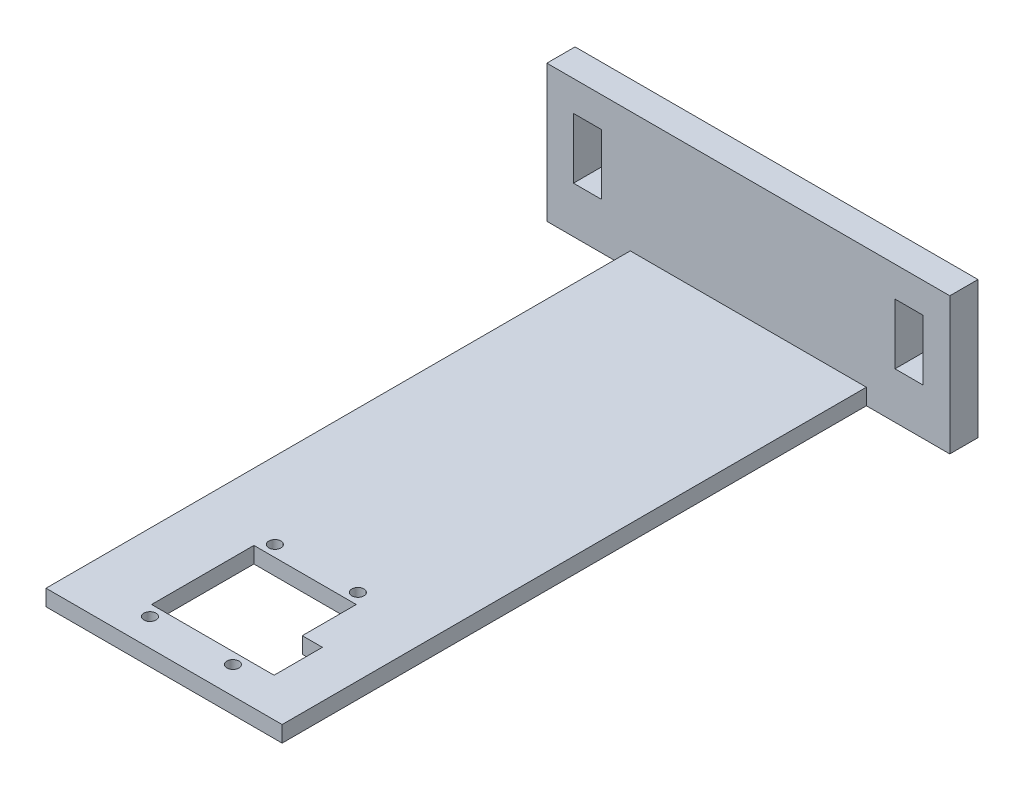
ISO-10303-21;
HEADER;
FILE_DESCRIPTION(('STEP AP214'),'2;1');
FILE_NAME('part.step','',(''),(''),'','','');
FILE_SCHEMA(('AUTOMOTIVE_DESIGN { 1 0 10303 214 1 1 1 1 }'));
ENDSEC;
DATA;
#1=APPLICATION_CONTEXT('core data for automotive mechanical design processes');
#2=APPLICATION_PROTOCOL_DEFINITION('international standard','automotive_design',2000,#1);
#3=PRODUCT_CONTEXT('',#1,'mechanical');
#4=PRODUCT('Part','Part','',(#3));
#5=PRODUCT_RELATED_PRODUCT_CATEGORY('part','',(#4));
#6=PRODUCT_DEFINITION_FORMATION('','',#4);
#7=PRODUCT_DEFINITION_CONTEXT('part definition',#1,'design');
#8=PRODUCT_DEFINITION('design','',#6,#7);
#9=PRODUCT_DEFINITION_SHAPE('','',#8);
#10=(LENGTH_UNIT() NAMED_UNIT(*) SI_UNIT(.MILLI.,.METRE.));
#11=(NAMED_UNIT(*) PLANE_ANGLE_UNIT() SI_UNIT($,.RADIAN.));
#12=(NAMED_UNIT(*) SI_UNIT($,.STERADIAN.) SOLID_ANGLE_UNIT());
#13=UNCERTAINTY_MEASURE_WITH_UNIT(LENGTH_MEASURE(1.E-05),#10,'distance_accuracy_value','');
#14=(GEOMETRIC_REPRESENTATION_CONTEXT(3) GLOBAL_UNCERTAINTY_ASSIGNED_CONTEXT((#13)) GLOBAL_UNIT_ASSIGNED_CONTEXT((#10,
#11,#12)) REPRESENTATION_CONTEXT('',''));
#15=CARTESIAN_POINT('',(0.,0.,0.));
#16=DIRECTION('',(0.,0.,1.));
#17=DIRECTION('',(1.,0.,0.));
#18=AXIS2_PLACEMENT_3D('',#15,#16,#17);
#19=CARTESIAN_POINT('',(-50.,34.,76.));
#20=DIRECTION('',(1.,0.,0.));
#21=DIRECTION('',(0.,0.,-1.));
#22=AXIS2_PLACEMENT_3D('',#19,#20,#21);
#23=PLANE('',#22);
#24=DIRECTION('',(0.,0.,1.));
#25=VECTOR('',#24,1.);
#26=CARTESIAN_POINT('',(-50.,0.,76.));
#27=LINE('',#26,#25);
#28=CARTESIAN_POINT('',(-50.,0.,-76.));
#29=VERTEX_POINT('',#28);
#30=CARTESIAN_POINT('',(-50.,0.,-69.));
#31=VERTEX_POINT('',#30);
#32=EDGE_CURVE('E361',#29,#31,#27,.T.);
#33=ORIENTED_EDGE('',*,*,#32,.T.);
#34=DIRECTION('',(0.,1.,0.));
#35=VECTOR('',#34,1.);
#36=CARTESIAN_POINT('',(-50.,4.,-69.));
#37=LINE('',#36,#35);
#38=CARTESIAN_POINT('',(-50.,34.,-69.));
#39=VERTEX_POINT('',#38);
#40=EDGE_CURVE('E358',#31,#39,#37,.T.);
#41=ORIENTED_EDGE('',*,*,#40,.T.);
#42=DIRECTION('',(0.,0.,1.));
#43=VECTOR('',#42,1.);
#44=CARTESIAN_POINT('',(-50.,34.,76.));
#45=LINE('',#44,#43);
#46=CARTESIAN_POINT('',(-50.,34.,-76.));
#47=VERTEX_POINT('',#46);
#48=EDGE_CURVE('E363',#47,#39,#45,.T.);
#49=ORIENTED_EDGE('',*,*,#48,.F.);
#50=DIRECTION('',(0.,-1.,0.));
#51=VECTOR('',#50,1.);
#52=CARTESIAN_POINT('',(-50.,34.,-76.));
#53=LINE('',#52,#51);
#54=EDGE_CURVE('E39',#47,#29,#53,.T.);
#55=ORIENTED_EDGE('',*,*,#54,.T.);
#56=EDGE_LOOP('',(#33,#41,#49,#55));
#57=FACE_BOUND('',#56,.T.);
#58=ADVANCED_FACE('F32',(#57),#23,.F.);
#59=CARTESIAN_POINT('',(50.,34.,76.));
#60=DIRECTION('',(0.,0.,-1.));
#61=DIRECTION('',(-1.,0.,0.));
#62=AXIS2_PLACEMENT_3D('',#59,#60,#61);
#63=PLANE('',#62);
#64=DIRECTION('',(1.,0.,0.));
#65=VECTOR('',#64,1.);
#66=CARTESIAN_POINT('',(50.,0.,76.));
#67=LINE('',#66,#65);
#68=CARTESIAN_POINT('',(-29.3,0.,76.));
#69=VERTEX_POINT('',#68);
#70=CARTESIAN_POINT('',(29.3,0.,76.));
#71=VERTEX_POINT('',#70);
#72=EDGE_CURVE('E373',#69,#71,#67,.T.);
#73=ORIENTED_EDGE('',*,*,#72,.T.);
#74=DIRECTION('',(0.,1.,0.));
#75=VECTOR('',#74,1.);
#76=CARTESIAN_POINT('',(29.3,0.,76.));
#77=LINE('',#76,#75);
#78=CARTESIAN_POINT('',(29.3,4.,76.));
#79=VERTEX_POINT('',#78);
#80=EDGE_CURVE('E270',#71,#79,#77,.T.);
#81=ORIENTED_EDGE('',*,*,#80,.T.);
#82=DIRECTION('',(1.,0.,0.));
#83=VECTOR('',#82,1.);
#84=CARTESIAN_POINT('',(-50.,4.,76.));
#85=LINE('',#84,#83);
#86=CARTESIAN_POINT('',(-29.3,4.,76.));
#87=VERTEX_POINT('',#86);
#88=EDGE_CURVE('E351',#87,#79,#85,.T.);
#89=ORIENTED_EDGE('',*,*,#88,.F.);
#90=DIRECTION('',(0.,1.,0.));
#91=VECTOR('',#90,1.);
#92=CARTESIAN_POINT('',(-29.3,0.,76.));
#93=LINE('',#92,#91);
#94=EDGE_CURVE('E54',#69,#87,#93,.T.);
#95=ORIENTED_EDGE('',*,*,#94,.F.);
#96=EDGE_LOOP('',(#73,#81,#89,#95));
#97=FACE_BOUND('',#96,.T.);
#98=ADVANCED_FACE('F407',(#97),#63,.F.);
#99=CARTESIAN_POINT('',(50.,34.,76.));
#100=DIRECTION('',(-1.,0.,0.));
#101=DIRECTION('',(0.,0.,1.));
#102=AXIS2_PLACEMENT_3D('',#99,#100,#101);
#103=PLANE('',#102);
#104=DIRECTION('',(0.,1.,0.));
#105=VECTOR('',#104,1.);
#106=CARTESIAN_POINT('',(50.,4.,-69.));
#107=LINE('',#106,#105);
#108=CARTESIAN_POINT('',(50.,0.,-69.));
#109=VERTEX_POINT('',#108);
#110=CARTESIAN_POINT('',(50.,34.,-69.));
#111=VERTEX_POINT('',#110);
#112=EDGE_CURVE('E356',#109,#111,#107,.T.);
#113=ORIENTED_EDGE('',*,*,#112,.F.);
#114=DIRECTION('',(0.,0.,-1.));
#115=VECTOR('',#114,1.);
#116=CARTESIAN_POINT('',(50.,0.,76.));
#117=LINE('',#116,#115);
#118=CARTESIAN_POINT('',(50.,0.,-76.));
#119=VERTEX_POINT('',#118);
#120=EDGE_CURVE('E376',#109,#119,#117,.T.);
#121=ORIENTED_EDGE('',*,*,#120,.T.);
#122=DIRECTION('',(0.,-1.,0.));
#123=VECTOR('',#122,1.);
#124=CARTESIAN_POINT('',(50.,34.,-76.));
#125=LINE('',#124,#123);
#126=CARTESIAN_POINT('',(50.,34.,-76.));
#127=VERTEX_POINT('',#126);
#128=EDGE_CURVE('E11',#127,#119,#125,.T.);
#129=ORIENTED_EDGE('',*,*,#128,.F.);
#130=DIRECTION('',(0.,0.,-1.));
#131=VECTOR('',#130,1.);
#132=CARTESIAN_POINT('',(50.,34.,76.));
#133=LINE('',#132,#131);
#134=EDGE_CURVE('E366',#111,#127,#133,.T.);
#135=ORIENTED_EDGE('',*,*,#134,.F.);
#136=EDGE_LOOP('',(#113,#121,#129,#135));
#137=FACE_BOUND('',#136,.T.);
#138=ADVANCED_FACE('F399',(#137),#103,.F.);
#139=CARTESIAN_POINT('',(50.,34.,-76.));
#140=DIRECTION('',(0.,0.,1.));
#141=DIRECTION('',(1.,0.,0.));
#142=AXIS2_PLACEMENT_3D('',#139,#140,#141);
#143=PLANE('',#142);
#144=DIRECTION('',(-1.,0.,0.));
#145=VECTOR('',#144,1.);
#146=CARTESIAN_POINT('',(36.4,26.5,-76.));
#147=LINE('',#146,#145);
#148=CARTESIAN_POINT('',(43.4,26.5,-76.));
#149=VERTEX_POINT('',#148);
#150=CARTESIAN_POINT('',(36.4,26.5,-76.));
#151=VERTEX_POINT('',#150);
#152=EDGE_CURVE('E297',#149,#151,#147,.T.);
#153=ORIENTED_EDGE('',*,*,#152,.T.);
#154=DIRECTION('',(0.,-1.,0.));
#155=VECTOR('',#154,1.);
#156=CARTESIAN_POINT('',(36.4,26.5,-76.));
#157=LINE('',#156,#155);
#158=CARTESIAN_POINT('',(36.4,11.5,-76.));
#159=VERTEX_POINT('',#158);
#160=EDGE_CURVE('E287',#151,#159,#157,.T.);
#161=ORIENTED_EDGE('',*,*,#160,.T.);
#162=DIRECTION('',(1.,0.,0.));
#163=VECTOR('',#162,1.);
#164=CARTESIAN_POINT('',(36.4,11.5,-76.));
#165=LINE('',#164,#163);
#166=CARTESIAN_POINT('',(43.4,11.5,-76.));
#167=VERTEX_POINT('',#166);
#168=EDGE_CURVE('E290',#159,#167,#165,.T.);
#169=ORIENTED_EDGE('',*,*,#168,.T.);
#170=DIRECTION('',(0.,1.,0.));
#171=VECTOR('',#170,1.);
#172=CARTESIAN_POINT('',(43.4,26.5,-76.));
#173=LINE('',#172,#171);
#174=EDGE_CURVE('E294',#167,#149,#173,.T.);
#175=ORIENTED_EDGE('',*,*,#174,.T.);
#176=EDGE_LOOP('',(#153,#161,#169,#175));
#177=FACE_BOUND('',#176,.T.);
#178=DIRECTION('',(-1.,0.,0.));
#179=VECTOR('',#178,1.);
#180=CARTESIAN_POINT('',(-43.4,26.5,-76.));
#181=LINE('',#180,#179);
#182=CARTESIAN_POINT('',(-36.4,26.5,-76.));
#183=VERTEX_POINT('',#182);
#184=CARTESIAN_POINT('',(-43.4,26.5,-76.));
#185=VERTEX_POINT('',#184);
#186=EDGE_CURVE('E329',#183,#185,#181,.T.);
#187=ORIENTED_EDGE('',*,*,#186,.T.);
#188=DIRECTION('',(0.,-1.,0.));
#189=VECTOR('',#188,1.);
#190=CARTESIAN_POINT('',(-43.4,26.5,-76.));
#191=LINE('',#190,#189);
#192=CARTESIAN_POINT('',(-43.4,11.5,-76.));
#193=VERTEX_POINT('',#192);
#194=EDGE_CURVE('E319',#185,#193,#191,.T.);
#195=ORIENTED_EDGE('',*,*,#194,.T.);
#196=DIRECTION('',(1.,0.,0.));
#197=VECTOR('',#196,1.);
#198=CARTESIAN_POINT('',(-43.4,11.5,-76.));
#199=LINE('',#198,#197);
#200=CARTESIAN_POINT('',(-36.4,11.5,-76.));
#201=VERTEX_POINT('',#200);
#202=EDGE_CURVE('E322',#193,#201,#199,.T.);
#203=ORIENTED_EDGE('',*,*,#202,.T.);
#204=DIRECTION('',(0.,1.,0.));
#205=VECTOR('',#204,1.);
#206=CARTESIAN_POINT('',(-36.4,26.5,-76.));
#207=LINE('',#206,#205);
#208=EDGE_CURVE('E326',#201,#183,#207,.T.);
#209=ORIENTED_EDGE('',*,*,#208,.T.);
#210=EDGE_LOOP('',(#187,#195,#203,#209));
#211=FACE_BOUND('',#210,.T.);
#212=DIRECTION('',(-1.,0.,0.));
#213=VECTOR('',#212,1.);
#214=CARTESIAN_POINT('',(50.,0.,-76.));
#215=LINE('',#214,#213);
#216=EDGE_CURVE('E367',#119,#29,#215,.T.);
#217=ORIENTED_EDGE('',*,*,#216,.T.);
#218=ORIENTED_EDGE('',*,*,#54,.F.);
#219=DIRECTION('',(-1.,0.,0.));
#220=VECTOR('',#219,1.);
#221=CARTESIAN_POINT('',(50.,34.,-76.));
#222=LINE('',#221,#220);
#223=EDGE_CURVE('E369',#127,#47,#222,.T.);
#224=ORIENTED_EDGE('',*,*,#223,.F.);
#225=ORIENTED_EDGE('',*,*,#128,.T.);
#226=EDGE_LOOP('',(#217,#218,#224,#225));
#227=FACE_BOUND('',#226,.T.);
#228=ADVANCED_FACE('F397',(#177,#211,#227),#143,.F.);
#229=CARTESIAN_POINT('',(0.,34.,0.));
#230=DIRECTION('',(0.,1.,0.));
#231=DIRECTION('',(0.,0.,1.));
#232=AXIS2_PLACEMENT_3D('',#229,#230,#231);
#233=PLANE('',#232);
#234=DIRECTION('',(-1.,0.,0.));
#235=VECTOR('',#234,1.);
#236=CARTESIAN_POINT('',(-50.,34.,-69.));
#237=LINE('',#236,#235);
#238=EDGE_CURVE('E344',#111,#39,#237,.T.);
#239=ORIENTED_EDGE('',*,*,#238,.F.);
#240=ORIENTED_EDGE('',*,*,#134,.T.);
#241=ORIENTED_EDGE('',*,*,#223,.T.);
#242=ORIENTED_EDGE('',*,*,#48,.T.);
#243=EDGE_LOOP('',(#239,#240,#241,#242));
#244=FACE_BOUND('',#243,.T.);
#245=ADVANCED_FACE('F394',(#244),#233,.T.);
#246=CARTESIAN_POINT('',(0.,0.,0.));
#247=DIRECTION('',(0.,1.,0.));
#248=DIRECTION('',(0.,0.,1.));
#249=AXIS2_PLACEMENT_3D('',#246,#247,#248);
#250=PLANE('',#249);
#251=CARTESIAN_POINT('',(-10.3,0.,69.2));
#252=DIRECTION('',(0.,1.,0.));
#253=DIRECTION('',(0.,0.,1.));
#254=AXIS2_PLACEMENT_3D('',#251,#252,#253);
#255=CIRCLE('',#254,1.5);
#256=CARTESIAN_POINT('',(-10.3,0.,70.7));
#257=VERTEX_POINT('',#256);
#258=EDGE_CURVE('E220',#257,#257,#255,.T.);
#259=ORIENTED_EDGE('',*,*,#258,.T.);
#260=EDGE_LOOP('',(#259));
#261=FACE_BOUND('',#260,.T.);
#262=CARTESIAN_POINT('',(10.3,0.,69.2));
#263=DIRECTION('',(0.,1.,0.));
#264=DIRECTION('',(0.,0.,1.));
#265=AXIS2_PLACEMENT_3D('',#262,#263,#264);
#266=CIRCLE('',#265,1.5);
#267=CARTESIAN_POINT('',(10.3,0.,70.7));
#268=VERTEX_POINT('',#267);
#269=EDGE_CURVE('E226',#268,#268,#266,.T.);
#270=ORIENTED_EDGE('',*,*,#269,.T.);
#271=EDGE_LOOP('',(#270));
#272=FACE_BOUND('',#271,.T.);
#273=CARTESIAN_POINT('',(10.3,0.,38.2));
#274=DIRECTION('',(0.,1.,0.));
#275=DIRECTION('',(0.,0.,1.));
#276=AXIS2_PLACEMENT_3D('',#273,#274,#275);
#277=CIRCLE('',#276,1.5);
#278=CARTESIAN_POINT('',(10.3,0.,39.7));
#279=VERTEX_POINT('',#278);
#280=EDGE_CURVE('E232',#279,#279,#277,.T.);
#281=ORIENTED_EDGE('',*,*,#280,.T.);
#282=EDGE_LOOP('',(#281));
#283=FACE_BOUND('',#282,.T.);
#284=CARTESIAN_POINT('',(-10.3,0.,38.2));
#285=DIRECTION('',(0.,1.,0.));
#286=DIRECTION('',(0.,0.,1.));
#287=AXIS2_PLACEMENT_3D('',#284,#285,#286);
#288=CIRCLE('',#287,1.5);
#289=CARTESIAN_POINT('',(-10.3,0.,39.7));
#290=VERTEX_POINT('',#289);
#291=EDGE_CURVE('E238',#290,#290,#288,.T.);
#292=ORIENTED_EDGE('',*,*,#291,.T.);
#293=EDGE_LOOP('',(#292));
#294=FACE_BOUND('',#293,.T.);
#295=DIRECTION('',(0.,0.,-1.));
#296=VECTOR('',#295,1.);
#297=CARTESIAN_POINT('',(17.7,0.,66.4));
#298=LINE('',#297,#296);
#299=CARTESIAN_POINT('',(17.7,0.,66.4));
#300=VERTEX_POINT('',#299);
#301=CARTESIAN_POINT('',(17.7,0.,54.4));
#302=VERTEX_POINT('',#301);
#303=EDGE_CURVE('E188',#300,#302,#298,.T.);
#304=ORIENTED_EDGE('',*,*,#303,.T.);
#305=DIRECTION('',(-1.,0.,0.));
#306=VECTOR('',#305,1.);
#307=CARTESIAN_POINT('',(12.7,0.,54.4));
#308=LINE('',#307,#306);
#309=CARTESIAN_POINT('',(12.7,0.,54.4));
#310=VERTEX_POINT('',#309);
#311=EDGE_CURVE('E204',#302,#310,#308,.T.);
#312=ORIENTED_EDGE('',*,*,#311,.T.);
#313=DIRECTION('',(0.,0.,-1.));
#314=VECTOR('',#313,1.);
#315=CARTESIAN_POINT('',(12.7,0.,41.));
#316=LINE('',#315,#314);
#317=CARTESIAN_POINT('',(12.7,0.,41.));
#318=VERTEX_POINT('',#317);
#319=EDGE_CURVE('E193',#310,#318,#316,.T.);
#320=ORIENTED_EDGE('',*,*,#319,.T.);
#321=DIRECTION('',(-1.,0.,0.));
#322=VECTOR('',#321,1.);
#323=CARTESIAN_POINT('',(-12.7,0.,41.));
#324=LINE('',#323,#322);
#325=CARTESIAN_POINT('',(-12.7,0.,41.));
#326=VERTEX_POINT('',#325);
#327=EDGE_CURVE('E246',#318,#326,#324,.T.);
#328=ORIENTED_EDGE('',*,*,#327,.T.);
#329=DIRECTION('',(0.,0.,1.));
#330=VECTOR('',#329,1.);
#331=CARTESIAN_POINT('',(-12.7,0.,41.));
#332=LINE('',#331,#330);
#333=CARTESIAN_POINT('',(-12.7,0.,66.4));
#334=VERTEX_POINT('',#333);
#335=EDGE_CURVE('E191',#326,#334,#332,.T.);
#336=ORIENTED_EDGE('',*,*,#335,.T.);
#337=DIRECTION('',(1.,0.,0.));
#338=VECTOR('',#337,1.);
#339=CARTESIAN_POINT('',(-12.7,0.,66.4));
#340=LINE('',#339,#338);
#341=EDGE_CURVE('E182',#334,#300,#340,.T.);
#342=ORIENTED_EDGE('',*,*,#341,.T.);
#343=EDGE_LOOP('',(#304,#312,#320,#328,#336,#342));
#344=FACE_BOUND('',#343,.T.);
#345=DIRECTION('',(-1.,0.,0.));
#346=VECTOR('',#345,1.);
#347=CARTESIAN_POINT('',(50.,0.,-69.));
#348=LINE('',#347,#346);
#349=CARTESIAN_POINT('',(29.3,0.,-69.));
#350=VERTEX_POINT('',#349);
#351=EDGE_CURVE('E262',#109,#350,#348,.T.);
#352=ORIENTED_EDGE('',*,*,#351,.T.);
#353=DIRECTION('',(0.,0.,1.));
#354=VECTOR('',#353,1.);
#355=CARTESIAN_POINT('',(29.3,0.,76.));
#356=LINE('',#355,#354);
#357=EDGE_CURVE('E265',#350,#71,#356,.T.);
#358=ORIENTED_EDGE('',*,*,#357,.T.);
#359=ORIENTED_EDGE('',*,*,#72,.F.);
#360=DIRECTION('',(0.,0.,-1.));
#361=VECTOR('',#360,1.);
#362=CARTESIAN_POINT('',(-29.3,0.,76.));
#363=LINE('',#362,#361);
#364=CARTESIAN_POINT('',(-29.3,0.,-69.));
#365=VERTEX_POINT('',#364);
#366=EDGE_CURVE('E275',#69,#365,#363,.T.);
#367=ORIENTED_EDGE('',*,*,#366,.T.);
#368=DIRECTION('',(-1.,0.,0.));
#369=VECTOR('',#368,1.);
#370=CARTESIAN_POINT('',(-50.,0.,-69.));
#371=LINE('',#370,#369);
#372=EDGE_CURVE('E278',#365,#31,#371,.T.);
#373=ORIENTED_EDGE('',*,*,#372,.T.);
#374=ORIENTED_EDGE('',*,*,#32,.F.);
#375=ORIENTED_EDGE('',*,*,#216,.F.);
#376=ORIENTED_EDGE('',*,*,#120,.F.);
#377=EDGE_LOOP('',(#352,#358,#359,#367,#373,#374,#375,#376));
#378=FACE_BOUND('',#377,.T.);
#379=ADVANCED_FACE('F184',(#261,#272,#283,#294,#344,#378),#250,.F.);
#380=CARTESIAN_POINT('',(-50.,4.,-69.));
#381=DIRECTION('',(0.,0.,-1.));
#382=DIRECTION('',(-1.,0.,0.));
#383=AXIS2_PLACEMENT_3D('',#380,#381,#382);
#384=PLANE('',#383);
#385=DIRECTION('',(1.,0.,0.));
#386=VECTOR('',#385,1.);
#387=CARTESIAN_POINT('',(36.4,11.5,-69.));
#388=LINE('',#387,#386);
#389=CARTESIAN_POINT('',(36.4,11.5,-69.));
#390=VERTEX_POINT('',#389);
#391=CARTESIAN_POINT('',(43.4,11.5,-69.));
#392=VERTEX_POINT('',#391);
#393=EDGE_CURVE('E302',#390,#392,#388,.T.);
#394=ORIENTED_EDGE('',*,*,#393,.F.);
#395=DIRECTION('',(0.,-1.,0.));
#396=VECTOR('',#395,1.);
#397=CARTESIAN_POINT('',(36.4,26.5,-69.));
#398=LINE('',#397,#396);
#399=CARTESIAN_POINT('',(36.4,26.5,-69.));
#400=VERTEX_POINT('',#399);
#401=EDGE_CURVE('E285',#400,#390,#398,.T.);
#402=ORIENTED_EDGE('',*,*,#401,.F.);
#403=DIRECTION('',(-1.,0.,0.));
#404=VECTOR('',#403,1.);
#405=CARTESIAN_POINT('',(36.4,26.5,-69.));
#406=LINE('',#405,#404);
#407=CARTESIAN_POINT('',(43.4,26.5,-69.));
#408=VERTEX_POINT('',#407);
#409=EDGE_CURVE('E291',#408,#400,#406,.T.);
#410=ORIENTED_EDGE('',*,*,#409,.F.);
#411=DIRECTION('',(0.,1.,0.));
#412=VECTOR('',#411,1.);
#413=CARTESIAN_POINT('',(43.4,26.5,-69.));
#414=LINE('',#413,#412);
#415=EDGE_CURVE('E305',#392,#408,#414,.T.);
#416=ORIENTED_EDGE('',*,*,#415,.F.);
#417=EDGE_LOOP('',(#394,#402,#410,#416));
#418=FACE_BOUND('',#417,.T.);
#419=DIRECTION('',(1.,0.,0.));
#420=VECTOR('',#419,1.);
#421=CARTESIAN_POINT('',(-43.4,11.5,-69.));
#422=LINE('',#421,#420);
#423=CARTESIAN_POINT('',(-43.4,11.5,-69.));
#424=VERTEX_POINT('',#423);
#425=CARTESIAN_POINT('',(-36.4,11.5,-69.));
#426=VERTEX_POINT('',#425);
#427=EDGE_CURVE('E334',#424,#426,#422,.T.);
#428=ORIENTED_EDGE('',*,*,#427,.F.);
#429=DIRECTION('',(0.,-1.,0.));
#430=VECTOR('',#429,1.);
#431=CARTESIAN_POINT('',(-43.4,26.5,-69.));
#432=LINE('',#431,#430);
#433=CARTESIAN_POINT('',(-43.4,26.5,-69.));
#434=VERTEX_POINT('',#433);
#435=EDGE_CURVE('E312',#434,#424,#432,.T.);
#436=ORIENTED_EDGE('',*,*,#435,.F.);
#437=DIRECTION('',(-1.,0.,0.));
#438=VECTOR('',#437,1.);
#439=CARTESIAN_POINT('',(-43.4,26.5,-69.));
#440=LINE('',#439,#438);
#441=CARTESIAN_POINT('',(-36.4,26.5,-69.));
#442=VERTEX_POINT('',#441);
#443=EDGE_CURVE('E323',#442,#434,#440,.T.);
#444=ORIENTED_EDGE('',*,*,#443,.F.);
#445=DIRECTION('',(0.,1.,0.));
#446=VECTOR('',#445,1.);
#447=CARTESIAN_POINT('',(-36.4,26.5,-69.));
#448=LINE('',#447,#446);
#449=EDGE_CURVE('E337',#426,#442,#448,.T.);
#450=ORIENTED_EDGE('',*,*,#449,.F.);
#451=EDGE_LOOP('',(#428,#436,#444,#450));
#452=FACE_BOUND('',#451,.T.);
#453=ORIENTED_EDGE('',*,*,#238,.T.);
#454=ORIENTED_EDGE('',*,*,#40,.F.);
#455=ORIENTED_EDGE('',*,*,#372,.F.);
#456=DIRECTION('',(0.,1.,0.));
#457=VECTOR('',#456,1.);
#458=CARTESIAN_POINT('',(-29.3,0.,-69.));
#459=LINE('',#458,#457);
#460=CARTESIAN_POINT('',(-29.3,4.,-69.));
#461=VERTEX_POINT('',#460);
#462=EDGE_CURVE('E282',#365,#461,#459,.T.);
#463=ORIENTED_EDGE('',*,*,#462,.T.);
#464=DIRECTION('',(-1.,0.,0.));
#465=VECTOR('',#464,1.);
#466=CARTESIAN_POINT('',(-50.,4.,-69.));
#467=LINE('',#466,#465);
#468=CARTESIAN_POINT('',(29.3,4.,-69.));
#469=VERTEX_POINT('',#468);
#470=EDGE_CURVE('E354',#469,#461,#467,.T.);
#471=ORIENTED_EDGE('',*,*,#470,.F.);
#472=DIRECTION('',(0.,1.,0.));
#473=VECTOR('',#472,1.);
#474=CARTESIAN_POINT('',(29.3,0.,-69.));
#475=LINE('',#474,#473);
#476=EDGE_CURVE('E268',#350,#469,#475,.T.);
#477=ORIENTED_EDGE('',*,*,#476,.F.);
#478=ORIENTED_EDGE('',*,*,#351,.F.);
#479=ORIENTED_EDGE('',*,*,#112,.T.);
#480=EDGE_LOOP('',(#453,#454,#455,#463,#471,#477,#478,#479));
#481=FACE_BOUND('',#480,.T.);
#482=ADVANCED_FACE('F390',(#418,#452,#481),#384,.F.);
#483=CARTESIAN_POINT('',(0.,4.,0.));
#484=DIRECTION('',(0.,-1.,0.));
#485=DIRECTION('',(0.,0.,-1.));
#486=AXIS2_PLACEMENT_3D('',#483,#484,#485);
#487=PLANE('',#486);
#488=CARTESIAN_POINT('',(-10.3,4.,69.2));
#489=DIRECTION('',(0.,1.,0.));
#490=DIRECTION('',(0.,0.,1.));
#491=AXIS2_PLACEMENT_3D('',#488,#489,#490);
#492=CIRCLE('',#491,1.5);
#493=CARTESIAN_POINT('',(-10.3,4.,70.7));
#494=VERTEX_POINT('',#493);
#495=EDGE_CURVE('E218',#494,#494,#492,.T.);
#496=ORIENTED_EDGE('',*,*,#495,.F.);
#497=EDGE_LOOP('',(#496));
#498=FACE_BOUND('',#497,.T.);
#499=CARTESIAN_POINT('',(10.3,4.,69.2));
#500=DIRECTION('',(0.,1.,0.));
#501=DIRECTION('',(0.,0.,1.));
#502=AXIS2_PLACEMENT_3D('',#499,#500,#501);
#503=CIRCLE('',#502,1.5);
#504=CARTESIAN_POINT('',(10.3,4.,70.7));
#505=VERTEX_POINT('',#504);
#506=EDGE_CURVE('E223',#505,#505,#503,.T.);
#507=ORIENTED_EDGE('',*,*,#506,.F.);
#508=EDGE_LOOP('',(#507));
#509=FACE_BOUND('',#508,.T.);
#510=CARTESIAN_POINT('',(10.3,4.,38.2));
#511=DIRECTION('',(0.,1.,0.));
#512=DIRECTION('',(0.,0.,1.));
#513=AXIS2_PLACEMENT_3D('',#510,#511,#512);
#514=CIRCLE('',#513,1.5);
#515=CARTESIAN_POINT('',(10.3,4.,39.7));
#516=VERTEX_POINT('',#515);
#517=EDGE_CURVE('E229',#516,#516,#514,.T.);
#518=ORIENTED_EDGE('',*,*,#517,.F.);
#519=EDGE_LOOP('',(#518));
#520=FACE_BOUND('',#519,.T.);
#521=CARTESIAN_POINT('',(-10.3,4.,38.2));
#522=DIRECTION('',(0.,1.,0.));
#523=DIRECTION('',(0.,0.,1.));
#524=AXIS2_PLACEMENT_3D('',#521,#522,#523);
#525=CIRCLE('',#524,1.5);
#526=CARTESIAN_POINT('',(-10.3,4.,39.7));
#527=VERTEX_POINT('',#526);
#528=EDGE_CURVE('E235',#527,#527,#525,.T.);
#529=ORIENTED_EDGE('',*,*,#528,.F.);
#530=EDGE_LOOP('',(#529));
#531=FACE_BOUND('',#530,.T.);
#532=DIRECTION('',(0.,0.,-1.));
#533=VECTOR('',#532,1.);
#534=CARTESIAN_POINT('',(12.7,4.,41.));
#535=LINE('',#534,#533);
#536=CARTESIAN_POINT('',(12.7,4.,54.4));
#537=VERTEX_POINT('',#536);
#538=CARTESIAN_POINT('',(12.7,4.,41.));
#539=VERTEX_POINT('',#538);
#540=EDGE_CURVE('E251',#537,#539,#535,.T.);
#541=ORIENTED_EDGE('',*,*,#540,.F.);
#542=DIRECTION('',(-1.,0.,0.));
#543=VECTOR('',#542,1.);
#544=CARTESIAN_POINT('',(12.7,4.,54.4));
#545=LINE('',#544,#543);
#546=CARTESIAN_POINT('',(17.7,4.,54.4));
#547=VERTEX_POINT('',#546);
#548=EDGE_CURVE('E208',#547,#537,#545,.T.);
#549=ORIENTED_EDGE('',*,*,#548,.F.);
#550=DIRECTION('',(0.,0.,-1.));
#551=VECTOR('',#550,1.);
#552=CARTESIAN_POINT('',(17.7,4.,66.4));
#553=LINE('',#552,#551);
#554=CARTESIAN_POINT('',(17.7,4.,66.4));
#555=VERTEX_POINT('',#554);
#556=EDGE_CURVE('E211',#555,#547,#553,.T.);
#557=ORIENTED_EDGE('',*,*,#556,.F.);
#558=DIRECTION('',(1.,0.,0.));
#559=VECTOR('',#558,1.);
#560=CARTESIAN_POINT('',(-12.7,4.,66.4));
#561=LINE('',#560,#559);
#562=CARTESIAN_POINT('',(-12.7,4.,66.4));
#563=VERTEX_POINT('',#562);
#564=EDGE_CURVE('E199',#563,#555,#561,.T.);
#565=ORIENTED_EDGE('',*,*,#564,.F.);
#566=DIRECTION('',(0.,0.,1.));
#567=VECTOR('',#566,1.);
#568=CARTESIAN_POINT('',(-12.7,4.,41.));
#569=LINE('',#568,#567);
#570=CARTESIAN_POINT('',(-12.7,4.,41.));
#571=VERTEX_POINT('',#570);
#572=EDGE_CURVE('E46',#571,#563,#569,.T.);
#573=ORIENTED_EDGE('',*,*,#572,.F.);
#574=DIRECTION('',(-1.,0.,0.));
#575=VECTOR('',#574,1.);
#576=CARTESIAN_POINT('',(-12.7,4.,41.));
#577=LINE('',#576,#575);
#578=EDGE_CURVE('E243',#539,#571,#577,.T.);
#579=ORIENTED_EDGE('',*,*,#578,.F.);
#580=EDGE_LOOP('',(#541,#549,#557,#565,#573,#579));
#581=FACE_BOUND('',#580,.T.);
#582=ORIENTED_EDGE('',*,*,#88,.T.);
#583=DIRECTION('',(0.,0.,1.));
#584=VECTOR('',#583,1.);
#585=CARTESIAN_POINT('',(29.3,4.,76.));
#586=LINE('',#585,#584);
#587=EDGE_CURVE('E257',#469,#79,#586,.T.);
#588=ORIENTED_EDGE('',*,*,#587,.F.);
#589=ORIENTED_EDGE('',*,*,#470,.T.);
#590=DIRECTION('',(0.,0.,-1.));
#591=VECTOR('',#590,1.);
#592=CARTESIAN_POINT('',(-29.3,4.,76.));
#593=LINE('',#592,#591);
#594=EDGE_CURVE('E273',#87,#461,#593,.T.);
#595=ORIENTED_EDGE('',*,*,#594,.F.);
#596=EDGE_LOOP('',(#582,#588,#589,#595));
#597=FACE_BOUND('',#596,.T.);
#598=ADVANCED_FACE('F409',(#498,#509,#520,#531,#581,#597),#487,.F.);
#599=CARTESIAN_POINT('',(-43.4,26.5,-76.));
#600=DIRECTION('',(-1.,0.,0.));
#601=DIRECTION('',(0.,0.,1.));
#602=AXIS2_PLACEMENT_3D('',#599,#600,#601);
#603=PLANE('',#602);
#604=ORIENTED_EDGE('',*,*,#435,.T.);
#605=DIRECTION('',(0.,0.,1.));
#606=VECTOR('',#605,1.);
#607=CARTESIAN_POINT('',(-43.4,11.5,-76.));
#608=LINE('',#607,#606);
#609=EDGE_CURVE('E332',#193,#424,#608,.T.);
#610=ORIENTED_EDGE('',*,*,#609,.F.);
#611=ORIENTED_EDGE('',*,*,#194,.F.);
#612=DIRECTION('',(0.,0.,1.));
#613=VECTOR('',#612,1.);
#614=CARTESIAN_POINT('',(-43.4,26.5,-76.));
#615=LINE('',#614,#613);
#616=EDGE_CURVE('E342',#185,#434,#615,.T.);
#617=ORIENTED_EDGE('',*,*,#616,.T.);
#618=EDGE_LOOP('',(#604,#610,#611,#617));
#619=FACE_BOUND('',#618,.T.);
#620=ADVANCED_FACE('F446',(#619),#603,.F.);
#621=CARTESIAN_POINT('',(-43.4,26.5,-76.));
#622=DIRECTION('',(0.,1.,0.));
#623=DIRECTION('',(0.,0.,1.));
#624=AXIS2_PLACEMENT_3D('',#621,#622,#623);
#625=PLANE('',#624);
#626=ORIENTED_EDGE('',*,*,#443,.T.);
#627=ORIENTED_EDGE('',*,*,#616,.F.);
#628=ORIENTED_EDGE('',*,*,#186,.F.);
#629=DIRECTION('',(0.,0.,1.));
#630=VECTOR('',#629,1.);
#631=CARTESIAN_POINT('',(-36.4,26.5,-76.));
#632=LINE('',#631,#630);
#633=EDGE_CURVE('E345',#183,#442,#632,.T.);
#634=ORIENTED_EDGE('',*,*,#633,.T.);
#635=EDGE_LOOP('',(#626,#627,#628,#634));
#636=FACE_BOUND('',#635,.T.);
#637=ADVANCED_FACE('F450',(#636),#625,.F.);
#638=CARTESIAN_POINT('',(-36.4,26.5,-76.));
#639=DIRECTION('',(1.,0.,0.));
#640=DIRECTION('',(0.,1.,0.));
#641=AXIS2_PLACEMENT_3D('',#638,#639,#640);
#642=PLANE('',#641);
#643=ORIENTED_EDGE('',*,*,#449,.T.);
#644=ORIENTED_EDGE('',*,*,#633,.F.);
#645=ORIENTED_EDGE('',*,*,#208,.F.);
#646=DIRECTION('',(0.,0.,1.));
#647=VECTOR('',#646,1.);
#648=CARTESIAN_POINT('',(-36.4,11.5,-76.));
#649=LINE('',#648,#647);
#650=EDGE_CURVE('E347',#201,#426,#649,.T.);
#651=ORIENTED_EDGE('',*,*,#650,.T.);
#652=EDGE_LOOP('',(#643,#644,#645,#651));
#653=FACE_BOUND('',#652,.T.);
#654=ADVANCED_FACE('F456',(#653),#642,.F.);
#655=CARTESIAN_POINT('',(-43.4,11.5,-76.));
#656=DIRECTION('',(0.,-1.,0.));
#657=DIRECTION('',(0.,0.,-1.));
#658=AXIS2_PLACEMENT_3D('',#655,#656,#657);
#659=PLANE('',#658);
#660=ORIENTED_EDGE('',*,*,#427,.T.);
#661=ORIENTED_EDGE('',*,*,#650,.F.);
#662=ORIENTED_EDGE('',*,*,#202,.F.);
#663=ORIENTED_EDGE('',*,*,#609,.T.);
#664=EDGE_LOOP('',(#660,#661,#662,#663));
#665=FACE_BOUND('',#664,.T.);
#666=ADVANCED_FACE('F452',(#665),#659,.F.);
#667=CARTESIAN_POINT('',(36.4,26.5,-76.));
#668=DIRECTION('',(-1.,0.,0.));
#669=DIRECTION('',(0.,-1.,0.));
#670=AXIS2_PLACEMENT_3D('',#667,#668,#669);
#671=PLANE('',#670);
#672=ORIENTED_EDGE('',*,*,#401,.T.);
#673=DIRECTION('',(0.,0.,1.));
#674=VECTOR('',#673,1.);
#675=CARTESIAN_POINT('',(36.4,11.5,-76.));
#676=LINE('',#675,#674);
#677=EDGE_CURVE('E300',#159,#390,#676,.T.);
#678=ORIENTED_EDGE('',*,*,#677,.F.);
#679=ORIENTED_EDGE('',*,*,#160,.F.);
#680=DIRECTION('',(0.,0.,1.));
#681=VECTOR('',#680,1.);
#682=CARTESIAN_POINT('',(36.4,26.5,-76.));
#683=LINE('',#682,#681);
#684=EDGE_CURVE('E310',#151,#400,#683,.T.);
#685=ORIENTED_EDGE('',*,*,#684,.T.);
#686=EDGE_LOOP('',(#672,#678,#679,#685));
#687=FACE_BOUND('',#686,.T.);
#688=ADVANCED_FACE('F455',(#687),#671,.F.);
#689=CARTESIAN_POINT('',(36.4,26.5,-76.));
#690=DIRECTION('',(0.,1.,0.));
#691=DIRECTION('',(-1.,0.,0.));
#692=AXIS2_PLACEMENT_3D('',#689,#690,#691);
#693=PLANE('',#692);
#694=ORIENTED_EDGE('',*,*,#409,.T.);
#695=ORIENTED_EDGE('',*,*,#684,.F.);
#696=ORIENTED_EDGE('',*,*,#152,.F.);
#697=DIRECTION('',(0.,0.,1.));
#698=VECTOR('',#697,1.);
#699=CARTESIAN_POINT('',(43.4,26.5,-76.));
#700=LINE('',#699,#698);
#701=EDGE_CURVE('E313',#149,#408,#700,.T.);
#702=ORIENTED_EDGE('',*,*,#701,.T.);
#703=EDGE_LOOP('',(#694,#695,#696,#702));
#704=FACE_BOUND('',#703,.T.);
#705=ADVANCED_FACE('F465',(#704),#693,.F.);
#706=CARTESIAN_POINT('',(43.4,26.5,-76.));
#707=DIRECTION('',(1.,0.,0.));
#708=DIRECTION('',(0.,1.,0.));
#709=AXIS2_PLACEMENT_3D('',#706,#707,#708);
#710=PLANE('',#709);
#711=ORIENTED_EDGE('',*,*,#415,.T.);
#712=ORIENTED_EDGE('',*,*,#701,.F.);
#713=ORIENTED_EDGE('',*,*,#174,.F.);
#714=DIRECTION('',(0.,0.,1.));
#715=VECTOR('',#714,1.);
#716=CARTESIAN_POINT('',(43.4,11.5,-76.));
#717=LINE('',#716,#715);
#718=EDGE_CURVE('E315',#167,#392,#717,.T.);
#719=ORIENTED_EDGE('',*,*,#718,.T.);
#720=EDGE_LOOP('',(#711,#712,#713,#719));
#721=FACE_BOUND('',#720,.T.);
#722=ADVANCED_FACE('F420',(#721),#710,.F.);
#723=CARTESIAN_POINT('',(36.4,11.5,-76.));
#724=DIRECTION('',(0.,-1.,0.));
#725=DIRECTION('',(0.,0.,-1.));
#726=AXIS2_PLACEMENT_3D('',#723,#724,#725);
#727=PLANE('',#726);
#728=ORIENTED_EDGE('',*,*,#393,.T.);
#729=ORIENTED_EDGE('',*,*,#718,.F.);
#730=ORIENTED_EDGE('',*,*,#168,.F.);
#731=ORIENTED_EDGE('',*,*,#677,.T.);
#732=EDGE_LOOP('',(#728,#729,#730,#731));
#733=FACE_BOUND('',#732,.T.);
#734=ADVANCED_FACE('F412',(#733),#727,.F.);
#735=CARTESIAN_POINT('',(-29.3,0.,76.));
#736=DIRECTION('',(1.,0.,0.));
#737=DIRECTION('',(0.,0.,-1.));
#738=AXIS2_PLACEMENT_3D('',#735,#736,#737);
#739=PLANE('',#738);
#740=ORIENTED_EDGE('',*,*,#594,.T.);
#741=ORIENTED_EDGE('',*,*,#462,.F.);
#742=ORIENTED_EDGE('',*,*,#366,.F.);
#743=ORIENTED_EDGE('',*,*,#94,.T.);
#744=EDGE_LOOP('',(#740,#741,#742,#743));
#745=FACE_BOUND('',#744,.T.);
#746=ADVANCED_FACE('F410',(#745),#739,.F.);
#747=CARTESIAN_POINT('',(29.3,0.,76.));
#748=DIRECTION('',(-1.,0.,0.));
#749=DIRECTION('',(0.,0.,1.));
#750=AXIS2_PLACEMENT_3D('',#747,#748,#749);
#751=PLANE('',#750);
#752=ORIENTED_EDGE('',*,*,#587,.T.);
#753=ORIENTED_EDGE('',*,*,#80,.F.);
#754=ORIENTED_EDGE('',*,*,#357,.F.);
#755=ORIENTED_EDGE('',*,*,#476,.T.);
#756=EDGE_LOOP('',(#752,#753,#754,#755));
#757=FACE_BOUND('',#756,.T.);
#758=ADVANCED_FACE('F404',(#757),#751,.F.);
#759=CARTESIAN_POINT('',(-12.7,0.,41.));
#760=DIRECTION('',(-1.,0.,0.));
#761=DIRECTION('',(0.,0.,1.));
#762=AXIS2_PLACEMENT_3D('',#759,#760,#761);
#763=PLANE('',#762);
#764=ORIENTED_EDGE('',*,*,#572,.T.);
#765=DIRECTION('',(0.,1.,0.));
#766=VECTOR('',#765,1.);
#767=CARTESIAN_POINT('',(-12.7,0.,66.4));
#768=LINE('',#767,#766);
#769=EDGE_CURVE('E248',#334,#563,#768,.T.);
#770=ORIENTED_EDGE('',*,*,#769,.F.);
#771=ORIENTED_EDGE('',*,*,#335,.F.);
#772=DIRECTION('',(0.,1.,0.));
#773=VECTOR('',#772,1.);
#774=CARTESIAN_POINT('',(-12.7,0.,41.));
#775=LINE('',#774,#773);
#776=EDGE_CURVE('E255',#326,#571,#775,.T.);
#777=ORIENTED_EDGE('',*,*,#776,.T.);
#778=EDGE_LOOP('',(#764,#770,#771,#777));
#779=FACE_BOUND('',#778,.T.);
#780=ADVANCED_FACE('F418',(#779),#763,.F.);
#781=CARTESIAN_POINT('',(-12.7,0.,41.));
#782=DIRECTION('',(0.,0.,-1.));
#783=DIRECTION('',(-1.,0.,0.));
#784=AXIS2_PLACEMENT_3D('',#781,#782,#783);
#785=PLANE('',#784);
#786=ORIENTED_EDGE('',*,*,#578,.T.);
#787=ORIENTED_EDGE('',*,*,#776,.F.);
#788=ORIENTED_EDGE('',*,*,#327,.F.);
#789=DIRECTION('',(0.,1.,0.));
#790=VECTOR('',#789,1.);
#791=CARTESIAN_POINT('',(12.7,0.,41.));
#792=LINE('',#791,#790);
#793=EDGE_CURVE('E258',#318,#539,#792,.T.);
#794=ORIENTED_EDGE('',*,*,#793,.T.);
#795=EDGE_LOOP('',(#786,#787,#788,#794));
#796=FACE_BOUND('',#795,.T.);
#797=ADVANCED_FACE('F543',(#796),#785,.F.);
#798=CARTESIAN_POINT('',(12.7,0.,41.));
#799=DIRECTION('',(1.,0.,0.));
#800=DIRECTION('',(0.,0.,-1.));
#801=AXIS2_PLACEMENT_3D('',#798,#799,#800);
#802=PLANE('',#801);
#803=ORIENTED_EDGE('',*,*,#319,.F.);
#804=DIRECTION('',(0.,1.,0.));
#805=VECTOR('',#804,1.);
#806=CARTESIAN_POINT('',(12.7,0.,54.4));
#807=LINE('',#806,#805);
#808=EDGE_CURVE('E215',#310,#537,#807,.T.);
#809=ORIENTED_EDGE('',*,*,#808,.T.);
#810=ORIENTED_EDGE('',*,*,#540,.T.);
#811=ORIENTED_EDGE('',*,*,#793,.F.);
#812=EDGE_LOOP('',(#803,#809,#810,#811));
#813=FACE_BOUND('',#812,.T.);
#814=ADVANCED_FACE('F552',(#813),#802,.F.);
#815=CARTESIAN_POINT('',(-12.7,0.,66.4));
#816=DIRECTION('',(0.,0.,1.));
#817=DIRECTION('',(1.,0.,0.));
#818=AXIS2_PLACEMENT_3D('',#815,#816,#817);
#819=PLANE('',#818);
#820=ORIENTED_EDGE('',*,*,#564,.T.);
#821=DIRECTION('',(0.,1.,0.));
#822=VECTOR('',#821,1.);
#823=CARTESIAN_POINT('',(17.7,0.,66.4));
#824=LINE('',#823,#822);
#825=EDGE_CURVE('E196',#300,#555,#824,.T.);
#826=ORIENTED_EDGE('',*,*,#825,.F.);
#827=ORIENTED_EDGE('',*,*,#341,.F.);
#828=ORIENTED_EDGE('',*,*,#769,.T.);
#829=EDGE_LOOP('',(#820,#826,#827,#828));
#830=FACE_BOUND('',#829,.T.);
#831=ADVANCED_FACE('F197',(#830),#819,.F.);
#832=CARTESIAN_POINT('',(-10.3,0.,38.2));
#833=DIRECTION('',(0.,1.,0.));
#834=DIRECTION('',(0.,0.,1.));
#835=AXIS2_PLACEMENT_3D('',#832,#833,#834);
#836=CYLINDRICAL_SURFACE('',#835,1.5);
#837=ORIENTED_EDGE('',*,*,#291,.F.);
#838=EDGE_LOOP('',(#837));
#839=FACE_BOUND('',#838,.T.);
#840=ORIENTED_EDGE('',*,*,#528,.T.);
#841=EDGE_LOOP('',(#840));
#842=FACE_BOUND('',#841,.T.);
#843=ADVANCED_FACE('F560',(#839,#842),#836,.F.);
#844=CARTESIAN_POINT('',(10.3,0.,38.2));
#845=DIRECTION('',(0.,1.,0.));
#846=DIRECTION('',(0.,0.,1.));
#847=AXIS2_PLACEMENT_3D('',#844,#845,#846);
#848=CYLINDRICAL_SURFACE('',#847,1.5);
#849=ORIENTED_EDGE('',*,*,#280,.F.);
#850=EDGE_LOOP('',(#849));
#851=FACE_BOUND('',#850,.T.);
#852=ORIENTED_EDGE('',*,*,#517,.T.);
#853=EDGE_LOOP('',(#852));
#854=FACE_BOUND('',#853,.T.);
#855=ADVANCED_FACE('F565',(#851,#854),#848,.F.);
#856=CARTESIAN_POINT('',(10.3,0.,69.2));
#857=DIRECTION('',(0.,1.,0.));
#858=DIRECTION('',(0.,0.,1.));
#859=AXIS2_PLACEMENT_3D('',#856,#857,#858);
#860=CYLINDRICAL_SURFACE('',#859,1.5);
#861=ORIENTED_EDGE('',*,*,#269,.F.);
#862=EDGE_LOOP('',(#861));
#863=FACE_BOUND('',#862,.T.);
#864=ORIENTED_EDGE('',*,*,#506,.T.);
#865=EDGE_LOOP('',(#864));
#866=FACE_BOUND('',#865,.T.);
#867=ADVANCED_FACE('F577',(#863,#866),#860,.F.);
#868=CARTESIAN_POINT('',(-10.3,0.,69.2));
#869=DIRECTION('',(0.,1.,0.));
#870=DIRECTION('',(0.,0.,1.));
#871=AXIS2_PLACEMENT_3D('',#868,#869,#870);
#872=CYLINDRICAL_SURFACE('',#871,1.5);
#873=ORIENTED_EDGE('',*,*,#258,.F.);
#874=EDGE_LOOP('',(#873));
#875=FACE_BOUND('',#874,.T.);
#876=ORIENTED_EDGE('',*,*,#495,.T.);
#877=EDGE_LOOP('',(#876));
#878=FACE_BOUND('',#877,.T.);
#879=ADVANCED_FACE('F587',(#875,#878),#872,.F.);
#880=CARTESIAN_POINT('',(12.7,0.,54.4));
#881=DIRECTION('',(0.,0.,-1.));
#882=DIRECTION('',(-1.,0.,0.));
#883=AXIS2_PLACEMENT_3D('',#880,#881,#882);
#884=PLANE('',#883);
#885=ORIENTED_EDGE('',*,*,#548,.T.);
#886=ORIENTED_EDGE('',*,*,#808,.F.);
#887=ORIENTED_EDGE('',*,*,#311,.F.);
#888=DIRECTION('',(0.,1.,0.));
#889=VECTOR('',#888,1.);
#890=CARTESIAN_POINT('',(17.7,0.,54.4));
#891=LINE('',#890,#889);
#892=EDGE_CURVE('E203',#302,#547,#891,.T.);
#893=ORIENTED_EDGE('',*,*,#892,.T.);
#894=EDGE_LOOP('',(#885,#886,#887,#893));
#895=FACE_BOUND('',#894,.T.);
#896=ADVANCED_FACE('F597',(#895),#884,.F.);
#897=CARTESIAN_POINT('',(17.7,0.,66.4));
#898=DIRECTION('',(1.,0.,0.));
#899=DIRECTION('',(0.,0.,-1.));
#900=AXIS2_PLACEMENT_3D('',#897,#898,#899);
#901=PLANE('',#900);
#902=ORIENTED_EDGE('',*,*,#556,.T.);
#903=ORIENTED_EDGE('',*,*,#892,.F.);
#904=ORIENTED_EDGE('',*,*,#303,.F.);
#905=ORIENTED_EDGE('',*,*,#825,.T.);
#906=EDGE_LOOP('',(#902,#903,#904,#905));
#907=FACE_BOUND('',#906,.T.);
#908=ADVANCED_FACE('F206',(#907),#901,.F.);
#909=CLOSED_SHELL('',(#58,#98,#138,#228,#245,#379,#482,#598,#620,#637,#654,#666,#688,#705,#722,
#734,#746,#758,#780,#797,#814,#831,#843,#855,#867,#879,#896,#908));
#910=MANIFOLD_SOLID_BREP('B2',#909);
#911=ADVANCED_BREP_SHAPE_REPRESENTATION('',(#18,#910),#14);
#912=SHAPE_DEFINITION_REPRESENTATION(#9,#911);
ENDSEC;
END-ISO-10303-21;
